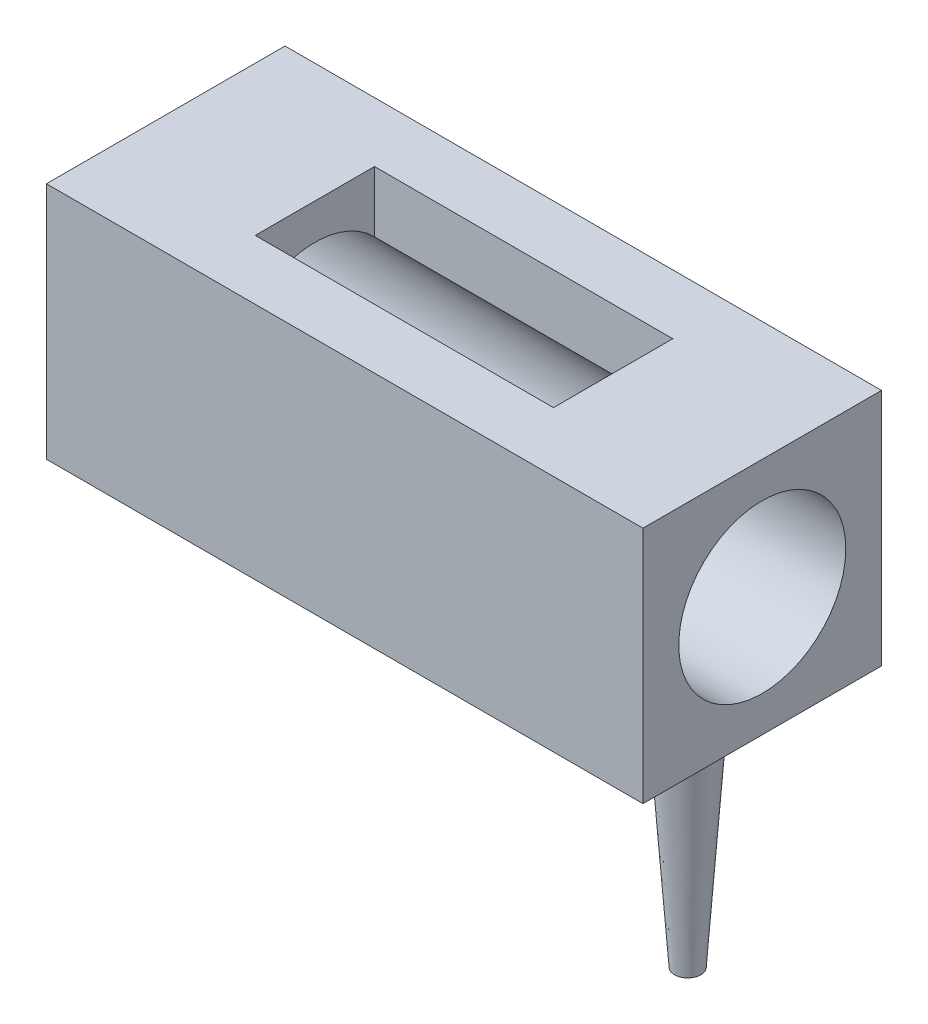
ISO-10303-21;
HEADER;
FILE_DESCRIPTION(('STEP AP214'),'2;1');
FILE_NAME('part.step','',(''),(''),'','','');
FILE_SCHEMA(('AUTOMOTIVE_DESIGN { 1 0 10303 214 1 1 1 1 }'));
ENDSEC;
DATA;
#1=APPLICATION_CONTEXT('core data for automotive mechanical design processes');
#2=APPLICATION_PROTOCOL_DEFINITION('international standard','automotive_design',2000,#1);
#3=PRODUCT_CONTEXT('',#1,'mechanical');
#4=PRODUCT('Part','Part','',(#3));
#5=PRODUCT_RELATED_PRODUCT_CATEGORY('part','',(#4));
#6=PRODUCT_DEFINITION_FORMATION('','',#4);
#7=PRODUCT_DEFINITION_CONTEXT('part definition',#1,'design');
#8=PRODUCT_DEFINITION('design','',#6,#7);
#9=PRODUCT_DEFINITION_SHAPE('','',#8);
#10=(LENGTH_UNIT() NAMED_UNIT(*) SI_UNIT(.MILLI.,.METRE.));
#11=(NAMED_UNIT(*) PLANE_ANGLE_UNIT() SI_UNIT($,.RADIAN.));
#12=(NAMED_UNIT(*) SI_UNIT($,.STERADIAN.) SOLID_ANGLE_UNIT());
#13=UNCERTAINTY_MEASURE_WITH_UNIT(LENGTH_MEASURE(1.E-05),#10,'distance_accuracy_value','');
#14=(GEOMETRIC_REPRESENTATION_CONTEXT(3) GLOBAL_UNCERTAINTY_ASSIGNED_CONTEXT((#13)) GLOBAL_UNIT_ASSIGNED_CONTEXT((#10,
#11,#12)) REPRESENTATION_CONTEXT('',''));
#15=CARTESIAN_POINT('',(0.,0.,0.));
#16=DIRECTION('',(0.,0.,1.));
#17=DIRECTION('',(1.,0.,0.));
#18=AXIS2_PLACEMENT_3D('',#15,#16,#17);
#19=CARTESIAN_POINT('',(0.,0.,400.));
#20=DIRECTION('',(1.,0.,0.));
#21=DIRECTION('',(0.,0.,-1.));
#22=AXIS2_PLACEMENT_3D('',#19,#20,#21);
#23=PLANE('',#22);
#24=CARTESIAN_POINT('',(0.,200.,200.));
#25=DIRECTION('',(1.,0.,0.));
#26=DIRECTION('',(0.,0.,-1.));
#27=AXIS2_PLACEMENT_3D('',#24,#25,#26);
#28=CIRCLE('',#27,140.);
#29=CARTESIAN_POINT('',(0.,200.,60.));
#30=VERTEX_POINT('',#29);
#31=EDGE_CURVE('E190',#30,#30,#28,.T.);
#32=ORIENTED_EDGE('',*,*,#31,.T.);
#33=EDGE_LOOP('',(#32));
#34=FACE_BOUND('',#33,.T.);
#35=DIRECTION('',(0.,-1.,0.));
#36=VECTOR('',#35,1.);
#37=CARTESIAN_POINT('',(0.,0.,0.));
#38=LINE('',#37,#36);
#39=CARTESIAN_POINT('',(0.,400.,0.));
#40=VERTEX_POINT('',#39);
#41=CARTESIAN_POINT('',(0.,0.,0.));
#42=VERTEX_POINT('',#41);
#43=EDGE_CURVE('E194',#40,#42,#38,.T.);
#44=ORIENTED_EDGE('',*,*,#43,.T.);
#45=DIRECTION('',(0.,0.,-1.));
#46=VECTOR('',#45,1.);
#47=CARTESIAN_POINT('',(0.,0.,400.));
#48=LINE('',#47,#46);
#49=CARTESIAN_POINT('',(0.,0.,400.));
#50=VERTEX_POINT('',#49);
#51=EDGE_CURVE('E235',#50,#42,#48,.T.);
#52=ORIENTED_EDGE('',*,*,#51,.F.);
#53=DIRECTION('',(0.,-1.,0.));
#54=VECTOR('',#53,1.);
#55=CARTESIAN_POINT('',(0.,0.,400.));
#56=LINE('',#55,#54);
#57=CARTESIAN_POINT('',(0.,400.,400.));
#58=VERTEX_POINT('',#57);
#59=EDGE_CURVE('E198',#58,#50,#56,.T.);
#60=ORIENTED_EDGE('',*,*,#59,.F.);
#61=DIRECTION('',(0.,0.,-1.));
#62=VECTOR('',#61,1.);
#63=CARTESIAN_POINT('',(0.,400.,400.));
#64=LINE('',#63,#62);
#65=EDGE_CURVE('E212',#58,#40,#64,.T.);
#66=ORIENTED_EDGE('',*,*,#65,.T.);
#67=EDGE_LOOP('',(#44,#52,#60,#66));
#68=FACE_BOUND('',#67,.T.);
#69=ADVANCED_FACE('F39',(#34,#68),#23,.F.);
#70=CARTESIAN_POINT('',(0.,0.,400.));
#71=DIRECTION('',(0.,1.,0.));
#72=DIRECTION('',(0.,0.,1.));
#73=AXIS2_PLACEMENT_3D('',#70,#71,#72);
#74=PLANE('',#73);
#75=CARTESIAN_POINT('',(875.,0.,200.));
#76=DIRECTION('',(0.,1.,0.));
#77=DIRECTION('',(0.,0.,1.));
#78=AXIS2_PLACEMENT_3D('',#75,#76,#77);
#79=CIRCLE('',#78,50.);
#80=CARTESIAN_POINT('',(875.,0.,250.));
#81=VERTEX_POINT('',#80);
#82=EDGE_CURVE('E11',#81,#81,#79,.F.);
#83=ORIENTED_EDGE('',*,*,#82,.F.);
#84=EDGE_LOOP('',(#83));
#85=FACE_BOUND('',#84,.T.);
#86=DIRECTION('',(1.,0.,0.));
#87=VECTOR('',#86,1.);
#88=CARTESIAN_POINT('',(250.,0.,100.));
#89=LINE('',#88,#87);
#90=CARTESIAN_POINT('',(250.,0.,100.));
#91=VERTEX_POINT('',#90);
#92=CARTESIAN_POINT('',(750.,0.,100.));
#93=VERTEX_POINT('',#92);
#94=EDGE_CURVE('E171',#91,#93,#89,.T.);
#95=ORIENTED_EDGE('',*,*,#94,.F.);
#96=DIRECTION('',(0.,0.,-1.));
#97=VECTOR('',#96,1.);
#98=CARTESIAN_POINT('',(250.,0.,300.));
#99=LINE('',#98,#97);
#100=CARTESIAN_POINT('',(250.,0.,300.));
#101=VERTEX_POINT('',#100);
#102=EDGE_CURVE('E54',#101,#91,#99,.T.);
#103=ORIENTED_EDGE('',*,*,#102,.F.);
#104=DIRECTION('',(-1.,0.,0.));
#105=VECTOR('',#104,1.);
#106=CARTESIAN_POINT('',(250.,0.,300.));
#107=LINE('',#106,#105);
#108=CARTESIAN_POINT('',(750.,0.,300.));
#109=VERTEX_POINT('',#108);
#110=EDGE_CURVE('E156',#109,#101,#107,.T.);
#111=ORIENTED_EDGE('',*,*,#110,.F.);
#112=DIRECTION('',(0.,0.,1.));
#113=VECTOR('',#112,1.);
#114=CARTESIAN_POINT('',(750.,0.,300.));
#115=LINE('',#114,#113);
#116=EDGE_CURVE('E160',#93,#109,#115,.T.);
#117=ORIENTED_EDGE('',*,*,#116,.F.);
#118=EDGE_LOOP('',(#95,#103,#111,#117));
#119=FACE_BOUND('',#118,.T.);
#120=DIRECTION('',(1.,0.,0.));
#121=VECTOR('',#120,1.);
#122=CARTESIAN_POINT('',(0.,0.,0.));
#123=LINE('',#122,#121);
#124=CARTESIAN_POINT('',(1000.,0.,0.));
#125=VERTEX_POINT('',#124);
#126=EDGE_CURVE('E216',#42,#125,#123,.T.);
#127=ORIENTED_EDGE('',*,*,#126,.T.);
#128=DIRECTION('',(0.,0.,-1.));
#129=VECTOR('',#128,1.);
#130=CARTESIAN_POINT('',(1000.,0.,400.));
#131=LINE('',#130,#129);
#132=CARTESIAN_POINT('',(1000.,0.,400.));
#133=VERTEX_POINT('',#132);
#134=EDGE_CURVE('E231',#133,#125,#131,.T.);
#135=ORIENTED_EDGE('',*,*,#134,.F.);
#136=DIRECTION('',(1.,0.,0.));
#137=VECTOR('',#136,1.);
#138=CARTESIAN_POINT('',(0.,0.,400.));
#139=LINE('',#138,#137);
#140=EDGE_CURVE('E202',#50,#133,#139,.T.);
#141=ORIENTED_EDGE('',*,*,#140,.F.);
#142=ORIENTED_EDGE('',*,*,#51,.T.);
#143=EDGE_LOOP('',(#127,#135,#141,#142));
#144=FACE_BOUND('',#143,.T.);
#145=ADVANCED_FACE('F285',(#85,#119,#144),#74,.F.);
#146=CARTESIAN_POINT('',(1000.,0.,400.));
#147=DIRECTION('',(-1.,0.,0.));
#148=DIRECTION('',(0.,0.,1.));
#149=AXIS2_PLACEMENT_3D('',#146,#147,#148);
#150=PLANE('',#149);
#151=CARTESIAN_POINT('',(1000.,200.,200.));
#152=DIRECTION('',(1.,0.,0.));
#153=DIRECTION('',(0.,0.,-1.));
#154=AXIS2_PLACEMENT_3D('',#151,#152,#153);
#155=CIRCLE('',#154,140.);
#156=CARTESIAN_POINT('',(1000.,200.,60.));
#157=VERTEX_POINT('',#156);
#158=EDGE_CURVE('E181',#157,#157,#155,.T.);
#159=ORIENTED_EDGE('',*,*,#158,.F.);
#160=EDGE_LOOP('',(#159));
#161=FACE_BOUND('',#160,.T.);
#162=DIRECTION('',(0.,1.,0.));
#163=VECTOR('',#162,1.);
#164=CARTESIAN_POINT('',(1000.,0.,0.));
#165=LINE('',#164,#163);
#166=CARTESIAN_POINT('',(1000.,400.,0.));
#167=VERTEX_POINT('',#166);
#168=EDGE_CURVE('E219',#125,#167,#165,.T.);
#169=ORIENTED_EDGE('',*,*,#168,.T.);
#170=DIRECTION('',(0.,0.,-1.));
#171=VECTOR('',#170,1.);
#172=CARTESIAN_POINT('',(1000.,400.,400.));
#173=LINE('',#172,#171);
#174=CARTESIAN_POINT('',(1000.,400.,400.));
#175=VERTEX_POINT('',#174);
#176=EDGE_CURVE('E227',#175,#167,#173,.T.);
#177=ORIENTED_EDGE('',*,*,#176,.F.);
#178=DIRECTION('',(0.,1.,0.));
#179=VECTOR('',#178,1.);
#180=CARTESIAN_POINT('',(1000.,0.,400.));
#181=LINE('',#180,#179);
#182=EDGE_CURVE('E206',#133,#175,#181,.T.);
#183=ORIENTED_EDGE('',*,*,#182,.F.);
#184=ORIENTED_EDGE('',*,*,#134,.T.);
#185=EDGE_LOOP('',(#169,#177,#183,#184));
#186=FACE_BOUND('',#185,.T.);
#187=ADVANCED_FACE('F290',(#161,#186),#150,.F.);
#188=CARTESIAN_POINT('',(0.,400.,400.));
#189=DIRECTION('',(0.,-1.,0.));
#190=DIRECTION('',(0.,0.,-1.));
#191=AXIS2_PLACEMENT_3D('',#188,#189,#190);
#192=PLANE('',#191);
#193=DIRECTION('',(-1.,0.,0.));
#194=VECTOR('',#193,1.);
#195=CARTESIAN_POINT('',(250.,400.,300.));
#196=LINE('',#195,#194);
#197=CARTESIAN_POINT('',(750.,400.,300.));
#198=VERTEX_POINT('',#197);
#199=CARTESIAN_POINT('',(250.,400.,300.));
#200=VERTEX_POINT('',#199);
#201=EDGE_CURVE('E154',#198,#200,#196,.T.);
#202=ORIENTED_EDGE('',*,*,#201,.T.);
#203=DIRECTION('',(0.,0.,-1.));
#204=VECTOR('',#203,1.);
#205=CARTESIAN_POINT('',(250.,400.,300.));
#206=LINE('',#205,#204);
#207=CARTESIAN_POINT('',(250.,400.,100.));
#208=VERTEX_POINT('',#207);
#209=EDGE_CURVE('E135',#200,#208,#206,.T.);
#210=ORIENTED_EDGE('',*,*,#209,.T.);
#211=DIRECTION('',(1.,0.,0.));
#212=VECTOR('',#211,1.);
#213=CARTESIAN_POINT('',(250.,400.,100.));
#214=LINE('',#213,#212);
#215=CARTESIAN_POINT('',(750.,400.,100.));
#216=VERTEX_POINT('',#215);
#217=EDGE_CURVE('E145',#208,#216,#214,.T.);
#218=ORIENTED_EDGE('',*,*,#217,.T.);
#219=DIRECTION('',(0.,0.,1.));
#220=VECTOR('',#219,1.);
#221=CARTESIAN_POINT('',(750.,400.,300.));
#222=LINE('',#221,#220);
#223=EDGE_CURVE('E62',#216,#198,#222,.T.);
#224=ORIENTED_EDGE('',*,*,#223,.T.);
#225=EDGE_LOOP('',(#202,#210,#218,#224));
#226=FACE_BOUND('',#225,.T.);
#227=DIRECTION('',(-1.,0.,0.));
#228=VECTOR('',#227,1.);
#229=CARTESIAN_POINT('',(0.,400.,0.));
#230=LINE('',#229,#228);
#231=EDGE_CURVE('E203',#167,#40,#230,.T.);
#232=ORIENTED_EDGE('',*,*,#231,.T.);
#233=ORIENTED_EDGE('',*,*,#65,.F.);
#234=DIRECTION('',(-1.,0.,0.));
#235=VECTOR('',#234,1.);
#236=CARTESIAN_POINT('',(0.,400.,400.));
#237=LINE('',#236,#235);
#238=EDGE_CURVE('E209',#175,#58,#237,.T.);
#239=ORIENTED_EDGE('',*,*,#238,.F.);
#240=ORIENTED_EDGE('',*,*,#176,.T.);
#241=EDGE_LOOP('',(#232,#233,#239,#240));
#242=FACE_BOUND('',#241,.T.);
#243=ADVANCED_FACE('F151',(#226,#242),#192,.F.);
#244=CARTESIAN_POINT('',(0.,0.,400.));
#245=DIRECTION('',(0.,0.,-1.));
#246=DIRECTION('',(-1.,0.,0.));
#247=AXIS2_PLACEMENT_3D('',#244,#245,#246);
#248=PLANE('',#247);
#249=ORIENTED_EDGE('',*,*,#59,.T.);
#250=ORIENTED_EDGE('',*,*,#140,.T.);
#251=ORIENTED_EDGE('',*,*,#182,.T.);
#252=ORIENTED_EDGE('',*,*,#238,.T.);
#253=EDGE_LOOP('',(#249,#250,#251,#252));
#254=FACE_BOUND('',#253,.T.);
#255=ADVANCED_FACE('F306',(#254),#248,.F.);
#256=CARTESIAN_POINT('',(0.,0.,0.));
#257=DIRECTION('',(0.,0.,-1.));
#258=DIRECTION('',(-1.,0.,0.));
#259=AXIS2_PLACEMENT_3D('',#256,#257,#258);
#260=PLANE('',#259);
#261=ORIENTED_EDGE('',*,*,#43,.F.);
#262=ORIENTED_EDGE('',*,*,#231,.F.);
#263=ORIENTED_EDGE('',*,*,#168,.F.);
#264=ORIENTED_EDGE('',*,*,#126,.F.);
#265=EDGE_LOOP('',(#261,#262,#263,#264));
#266=FACE_BOUND('',#265,.T.);
#267=ADVANCED_FACE('F300',(#266),#260,.T.);
#268=CARTESIAN_POINT('',(0.,200.,200.));
#269=DIRECTION('',(1.,0.,0.));
#270=DIRECTION('',(0.,0.,-1.));
#271=AXIS2_PLACEMENT_3D('',#268,#269,#270);
#272=CYLINDRICAL_SURFACE('',#271,140.);
#273=DIRECTION('',(1.,0.,0.));
#274=VECTOR('',#273,1.);
#275=CARTESIAN_POINT('',(0.,297.979589711327,100.));
#276=LINE('',#275,#274);
#277=CARTESIAN_POINT('',(750.,297.979589711327,100.));
#278=VERTEX_POINT('',#277);
#279=CARTESIAN_POINT('',(250.,297.979589711327,100.));
#280=VERTEX_POINT('',#279);
#281=EDGE_CURVE('E256',#278,#280,#276,.F.);
#282=ORIENTED_EDGE('',*,*,#281,.T.);
#283=CARTESIAN_POINT('',(250.,200.,200.));
#284=DIRECTION('',(-1.,0.,0.));
#285=DIRECTION('',(0.,0.,1.));
#286=AXIS2_PLACEMENT_3D('',#283,#284,#285);
#287=CIRCLE('',#286,140.);
#288=CARTESIAN_POINT('',(250.,297.979589711327,300.));
#289=VERTEX_POINT('',#288);
#290=EDGE_CURVE('E47',#280,#289,#287,.F.);
#291=ORIENTED_EDGE('',*,*,#290,.T.);
#292=DIRECTION('',(1.,0.,0.));
#293=VECTOR('',#292,1.);
#294=CARTESIAN_POINT('',(0.,297.979589711327,300.));
#295=LINE('',#294,#293);
#296=CARTESIAN_POINT('',(750.,297.979589711327,300.));
#297=VERTEX_POINT('',#296);
#298=EDGE_CURVE('E258',#289,#297,#295,.T.);
#299=ORIENTED_EDGE('',*,*,#298,.T.);
#300=CARTESIAN_POINT('',(750.,200.,200.));
#301=DIRECTION('',(1.,0.,0.));
#302=DIRECTION('',(0.,0.,-1.));
#303=AXIS2_PLACEMENT_3D('',#300,#301,#302);
#304=CIRCLE('',#303,140.);
#305=EDGE_CURVE('E248',#297,#278,#304,.F.);
#306=ORIENTED_EDGE('',*,*,#305,.T.);
#307=EDGE_LOOP('',(#282,#291,#299,#306));
#308=FACE_BOUND('',#307,.T.);
#309=DIRECTION('',(1.,0.,0.));
#310=VECTOR('',#309,1.);
#311=CARTESIAN_POINT('',(0.,102.020410288673,300.));
#312=LINE('',#311,#310);
#313=CARTESIAN_POINT('',(750.,102.020410288673,300.));
#314=VERTEX_POINT('',#313);
#315=CARTESIAN_POINT('',(250.,102.020410288673,300.));
#316=VERTEX_POINT('',#315);
#317=EDGE_CURVE('E247',#314,#316,#312,.F.);
#318=ORIENTED_EDGE('',*,*,#317,.T.);
#319=CARTESIAN_POINT('',(250.,102.020410288673,100.));
#320=VERTEX_POINT('',#319);
#321=EDGE_CURVE('E252',#316,#320,#287,.F.);
#322=ORIENTED_EDGE('',*,*,#321,.T.);
#323=DIRECTION('',(1.,0.,0.));
#324=VECTOR('',#323,1.);
#325=CARTESIAN_POINT('',(0.,102.020410288673,100.));
#326=LINE('',#325,#324);
#327=CARTESIAN_POINT('',(750.,102.020410288673,100.));
#328=VERTEX_POINT('',#327);
#329=EDGE_CURVE('E239',#320,#328,#326,.T.);
#330=ORIENTED_EDGE('',*,*,#329,.T.);
#331=EDGE_CURVE('E243',#328,#314,#304,.F.);
#332=ORIENTED_EDGE('',*,*,#331,.T.);
#333=EDGE_LOOP('',(#318,#322,#330,#332));
#334=FACE_BOUND('',#333,.T.);
#335=ORIENTED_EDGE('',*,*,#31,.F.);
#336=EDGE_LOOP('',(#335));
#337=FACE_BOUND('',#336,.T.);
#338=ORIENTED_EDGE('',*,*,#158,.T.);
#339=EDGE_LOOP('',(#338));
#340=FACE_BOUND('',#339,.T.);
#341=ADVANCED_FACE('F265',(#308,#334,#337,#340),#272,.F.);
#342=CARTESIAN_POINT('',(250.,400.,100.));
#343=DIRECTION('',(0.,0.,-1.));
#344=DIRECTION('',(-1.,0.,0.));
#345=AXIS2_PLACEMENT_3D('',#342,#343,#344);
#346=PLANE('',#345);
#347=DIRECTION('',(0.,-1.,0.));
#348=VECTOR('',#347,1.);
#349=CARTESIAN_POINT('',(250.,400.,100.));
#350=LINE('',#349,#348);
#351=EDGE_CURVE('E142',#320,#91,#350,.T.);
#352=ORIENTED_EDGE('',*,*,#351,.T.);
#353=ORIENTED_EDGE('',*,*,#94,.T.);
#354=DIRECTION('',(0.,-1.,0.));
#355=VECTOR('',#354,1.);
#356=CARTESIAN_POINT('',(750.,400.,100.));
#357=LINE('',#356,#355);
#358=EDGE_CURVE('E141',#328,#93,#357,.T.);
#359=ORIENTED_EDGE('',*,*,#358,.F.);
#360=ORIENTED_EDGE('',*,*,#329,.F.);
#361=EDGE_LOOP('',(#352,#353,#359,#360));
#362=FACE_BOUND('',#361,.T.);
#363=ADVANCED_FACE('F324',(#362),#346,.F.);
#364=CARTESIAN_POINT('',(750.,400.,300.));
#365=DIRECTION('',(1.,0.,0.));
#366=DIRECTION('',(0.,0.,-1.));
#367=AXIS2_PLACEMENT_3D('',#364,#365,#366);
#368=PLANE('',#367);
#369=ORIENTED_EDGE('',*,*,#358,.T.);
#370=ORIENTED_EDGE('',*,*,#116,.T.);
#371=DIRECTION('',(0.,-1.,0.));
#372=VECTOR('',#371,1.);
#373=CARTESIAN_POINT('',(750.,400.,300.));
#374=LINE('',#373,#372);
#375=EDGE_CURVE('E187',#314,#109,#374,.T.);
#376=ORIENTED_EDGE('',*,*,#375,.F.);
#377=ORIENTED_EDGE('',*,*,#331,.F.);
#378=EDGE_LOOP('',(#369,#370,#376,#377));
#379=FACE_BOUND('',#378,.T.);
#380=ADVANCED_FACE('F278',(#379),#368,.F.);
#381=CARTESIAN_POINT('',(250.,400.,300.));
#382=DIRECTION('',(0.,0.,1.));
#383=DIRECTION('',(1.,0.,0.));
#384=AXIS2_PLACEMENT_3D('',#381,#382,#383);
#385=PLANE('',#384);
#386=ORIENTED_EDGE('',*,*,#375,.T.);
#387=ORIENTED_EDGE('',*,*,#110,.T.);
#388=DIRECTION('',(0.,-1.,0.));
#389=VECTOR('',#388,1.);
#390=CARTESIAN_POINT('',(250.,400.,300.));
#391=LINE('',#390,#389);
#392=EDGE_CURVE('E182',#316,#101,#391,.T.);
#393=ORIENTED_EDGE('',*,*,#392,.F.);
#394=ORIENTED_EDGE('',*,*,#317,.F.);
#395=EDGE_LOOP('',(#386,#387,#393,#394));
#396=FACE_BOUND('',#395,.T.);
#397=ADVANCED_FACE('F272',(#396),#385,.F.);
#398=CARTESIAN_POINT('',(250.,400.,300.));
#399=DIRECTION('',(-1.,0.,0.));
#400=DIRECTION('',(0.,0.,1.));
#401=AXIS2_PLACEMENT_3D('',#398,#399,#400);
#402=PLANE('',#401);
#403=ORIENTED_EDGE('',*,*,#392,.T.);
#404=ORIENTED_EDGE('',*,*,#102,.T.);
#405=ORIENTED_EDGE('',*,*,#351,.F.);
#406=ORIENTED_EDGE('',*,*,#321,.F.);
#407=EDGE_LOOP('',(#403,#404,#405,#406));
#408=FACE_BOUND('',#407,.T.);
#409=ADVANCED_FACE('F279',(#408),#402,.F.);
#410=EDGE_CURVE('E130',#208,#280,#350,.T.);
#411=ORIENTED_EDGE('',*,*,#410,.F.);
#412=ORIENTED_EDGE('',*,*,#209,.F.);
#413=EDGE_CURVE('E178',#200,#289,#391,.T.);
#414=ORIENTED_EDGE('',*,*,#413,.T.);
#415=ORIENTED_EDGE('',*,*,#290,.F.);
#416=EDGE_LOOP('',(#411,#412,#414,#415));
#417=FACE_BOUND('',#416,.T.);
#418=ADVANCED_FACE('F132',(#417),#402,.F.);
#419=ORIENTED_EDGE('',*,*,#413,.F.);
#420=ORIENTED_EDGE('',*,*,#201,.F.);
#421=EDGE_CURVE('E183',#198,#297,#374,.T.);
#422=ORIENTED_EDGE('',*,*,#421,.T.);
#423=ORIENTED_EDGE('',*,*,#298,.F.);
#424=EDGE_LOOP('',(#419,#420,#422,#423));
#425=FACE_BOUND('',#424,.T.);
#426=ADVANCED_FACE('F269',(#425),#385,.F.);
#427=ORIENTED_EDGE('',*,*,#421,.F.);
#428=ORIENTED_EDGE('',*,*,#223,.F.);
#429=EDGE_CURVE('E147',#216,#278,#357,.T.);
#430=ORIENTED_EDGE('',*,*,#429,.T.);
#431=ORIENTED_EDGE('',*,*,#305,.F.);
#432=EDGE_LOOP('',(#427,#428,#430,#431));
#433=FACE_BOUND('',#432,.T.);
#434=ADVANCED_FACE('F267',(#433),#368,.F.);
#435=ORIENTED_EDGE('',*,*,#429,.F.);
#436=ORIENTED_EDGE('',*,*,#217,.F.);
#437=ORIENTED_EDGE('',*,*,#410,.T.);
#438=ORIENTED_EDGE('',*,*,#281,.F.);
#439=EDGE_LOOP('',(#435,#436,#437,#438));
#440=FACE_BOUND('',#439,.T.);
#441=ADVANCED_FACE('F146',(#440),#346,.F.);
#442=CARTESIAN_POINT('',(875.,0.,200.));
#443=DIRECTION('',(0.,1.,0.));
#444=DIRECTION('',(0.,0.,-1.));
#445=AXIS2_PLACEMENT_3D('',#442,#443,#444);
#446=CONICAL_SURFACE('',#445,50.,0.0698131700797733);
#447=CARTESIAN_POINT('',(875.,-400.,200.));
#448=DIRECTION('',(0.,-1.,0.));
#449=DIRECTION('',(0.,0.,-1.));
#450=AXIS2_PLACEMENT_3D('',#447,#448,#449);
#451=CIRCLE('',#450,22.0292752225958);
#452=CARTESIAN_POINT('',(875.,-400.,177.970724777404));
#453=VERTEX_POINT('',#452);
#454=EDGE_CURVE('E163',#453,#453,#451,.T.);
#455=ORIENTED_EDGE('',*,*,#454,.F.);
#456=EDGE_LOOP('',(#455));
#457=FACE_BOUND('',#456,.T.);
#458=ORIENTED_EDGE('',*,*,#82,.T.);
#459=EDGE_LOOP('',(#458));
#460=FACE_BOUND('',#459,.T.);
#461=ADVANCED_FACE('F328',(#457,#460),#446,.T.);
#462=CARTESIAN_POINT('',(875.,-400.,200.));
#463=DIRECTION('',(0.,-1.,0.));
#464=DIRECTION('',(0.,0.,-1.));
#465=AXIS2_PLACEMENT_3D('',#462,#463,#464);
#466=PLANE('',#465);
#467=ORIENTED_EDGE('',*,*,#454,.T.);
#468=EDGE_LOOP('',(#467));
#469=FACE_BOUND('',#468,.T.);
#470=ADVANCED_FACE('F393',(#469),#466,.T.);
#471=CLOSED_SHELL('',(#69,#145,#187,#243,#255,#267,#341,#363,#380,#397,#409,#418,#426,#434,#441,
#461,#470));
#472=MANIFOLD_SOLID_BREP('B2',#471);
#473=ADVANCED_BREP_SHAPE_REPRESENTATION('',(#18,#472),#14);
#474=SHAPE_DEFINITION_REPRESENTATION(#9,#473);
ENDSEC;
END-ISO-10303-21;
